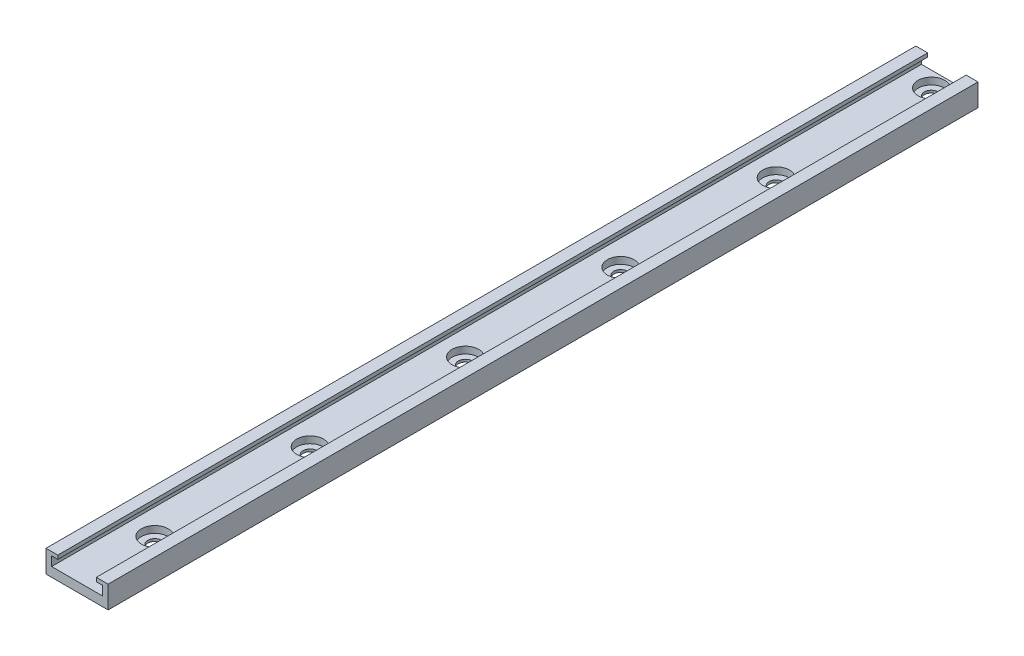
ISO-10303-21;
HEADER;
FILE_DESCRIPTION(('STEP AP214'),'2;1');
FILE_NAME('part.step','',(''),(''),'','','');
FILE_SCHEMA(('AUTOMOTIVE_DESIGN { 1 0 10303 214 1 1 1 1 }'));
ENDSEC;
DATA;
#1=APPLICATION_CONTEXT('core data for automotive mechanical design processes');
#2=APPLICATION_PROTOCOL_DEFINITION('international standard','automotive_design',2000,#1);
#3=PRODUCT_CONTEXT('',#1,'mechanical');
#4=PRODUCT('Part','Part','',(#3));
#5=PRODUCT_RELATED_PRODUCT_CATEGORY('part','',(#4));
#6=PRODUCT_DEFINITION_FORMATION('','',#4);
#7=PRODUCT_DEFINITION_CONTEXT('part definition',#1,'design');
#8=PRODUCT_DEFINITION('design','',#6,#7);
#9=PRODUCT_DEFINITION_SHAPE('','',#8);
#10=(LENGTH_UNIT() NAMED_UNIT(*) SI_UNIT(.MILLI.,.METRE.));
#11=(NAMED_UNIT(*) PLANE_ANGLE_UNIT() SI_UNIT($,.RADIAN.));
#12=(NAMED_UNIT(*) SI_UNIT($,.STERADIAN.) SOLID_ANGLE_UNIT());
#13=UNCERTAINTY_MEASURE_WITH_UNIT(LENGTH_MEASURE(1.E-05),#10,'distance_accuracy_value','');
#14=(GEOMETRIC_REPRESENTATION_CONTEXT(3) GLOBAL_UNCERTAINTY_ASSIGNED_CONTEXT((#13)) GLOBAL_UNIT_ASSIGNED_CONTEXT((#10,
#11,#12)) REPRESENTATION_CONTEXT('',''));
#15=CARTESIAN_POINT('',(0.,0.,0.));
#16=DIRECTION('',(0.,0.,1.));
#17=DIRECTION('',(1.,0.,0.));
#18=AXIS2_PLACEMENT_3D('',#15,#16,#17);
#19=CARTESIAN_POINT('',(18.2,5.9696814147909,280.));
#20=DIRECTION('',(1.,0.,0.));
#21=DIRECTION('',(0.,0.,-1.));
#22=AXIS2_PLACEMENT_3D('',#19,#20,#21);
#23=PLANE('',#22);
#24=DIRECTION('',(0.,-1.,0.));
#25=VECTOR('',#24,1.);
#26=CARTESIAN_POINT('',(18.2,5.9696814147909,0.));
#27=LINE('',#26,#25);
#28=CARTESIAN_POINT('',(18.2,5.9696814147909,0.));
#29=VERTEX_POINT('',#28);
#30=CARTESIAN_POINT('',(18.2,3.,0.));
#31=VERTEX_POINT('',#30);
#32=EDGE_CURVE('E152',#29,#31,#27,.T.);
#33=ORIENTED_EDGE('',*,*,#32,.T.);
#34=DIRECTION('',(0.,0.,-1.));
#35=VECTOR('',#34,1.);
#36=CARTESIAN_POINT('',(18.2,3.,280.));
#37=LINE('',#36,#35);
#38=CARTESIAN_POINT('',(18.2,3.,280.));
#39=VERTEX_POINT('',#38);
#40=EDGE_CURVE('E11',#39,#31,#37,.T.);
#41=ORIENTED_EDGE('',*,*,#40,.F.);
#42=DIRECTION('',(0.,-1.,0.));
#43=VECTOR('',#42,1.);
#44=CARTESIAN_POINT('',(18.2,5.9696814147909,280.));
#45=LINE('',#44,#43);
#46=CARTESIAN_POINT('',(18.2,5.9696814147909,280.));
#47=VERTEX_POINT('',#46);
#48=EDGE_CURVE('E175',#47,#39,#45,.T.);
#49=ORIENTED_EDGE('',*,*,#48,.F.);
#50=DIRECTION('',(0.,0.,-1.));
#51=VECTOR('',#50,1.);
#52=CARTESIAN_POINT('',(18.2,5.9696814147909,280.));
#53=LINE('',#52,#51);
#54=EDGE_CURVE('E148',#47,#29,#53,.T.);
#55=ORIENTED_EDGE('',*,*,#54,.T.);
#56=EDGE_LOOP('',(#33,#41,#49,#55));
#57=FACE_BOUND('',#56,.T.);
#58=ADVANCED_FACE('F32',(#57),#23,.F.);
#59=CARTESIAN_POINT('',(18.2,3.,280.));
#60=DIRECTION('',(0.,-1.,0.));
#61=DIRECTION('',(1.,0.,0.));
#62=AXIS2_PLACEMENT_3D('',#59,#60,#61);
#63=PLANE('',#62);
#64=CARTESIAN_POINT('',(10.,3.,5.));
#65=DIRECTION('',(0.,1.,0.));
#66=DIRECTION('',(0.,0.,1.));
#67=AXIS2_PLACEMENT_3D('',#64,#65,#66);
#68=CIRCLE('',#67,4.29999999999999);
#69=CARTESIAN_POINT('',(10.,3.,9.3));
#70=VERTEX_POINT('',#69);
#71=EDGE_CURVE('E511',#70,#70,#68,.T.);
#72=ORIENTED_EDGE('',*,*,#71,.F.);
#73=EDGE_LOOP('',(#72));
#74=FACE_BOUND('',#73,.T.);
#75=CARTESIAN_POINT('',(10.,3.,255.));
#76=DIRECTION('',(0.,1.,0.));
#77=DIRECTION('',(0.,0.,1.));
#78=AXIS2_PLACEMENT_3D('',#75,#76,#77);
#79=CIRCLE('',#78,4.3);
#80=CARTESIAN_POINT('',(10.,3.,259.3));
#81=VERTEX_POINT('',#80);
#82=EDGE_CURVE('E521',#81,#81,#79,.T.);
#83=ORIENTED_EDGE('',*,*,#82,.F.);
#84=EDGE_LOOP('',(#83));
#85=FACE_BOUND('',#84,.T.);
#86=CARTESIAN_POINT('',(10.,3.,205.));
#87=DIRECTION('',(0.,1.,0.));
#88=DIRECTION('',(0.,0.,1.));
#89=AXIS2_PLACEMENT_3D('',#86,#87,#88);
#90=CIRCLE('',#89,4.3);
#91=CARTESIAN_POINT('',(10.,3.,209.3));
#92=VERTEX_POINT('',#91);
#93=EDGE_CURVE('E533',#92,#92,#90,.T.);
#94=ORIENTED_EDGE('',*,*,#93,.F.);
#95=EDGE_LOOP('',(#94));
#96=FACE_BOUND('',#95,.T.);
#97=CARTESIAN_POINT('',(10.,3.,155.));
#98=DIRECTION('',(0.,1.,0.));
#99=DIRECTION('',(0.,0.,1.));
#100=AXIS2_PLACEMENT_3D('',#97,#98,#99);
#101=CIRCLE('',#100,4.3);
#102=CARTESIAN_POINT('',(10.,3.,159.3));
#103=VERTEX_POINT('',#102);
#104=EDGE_CURVE('E545',#103,#103,#101,.T.);
#105=ORIENTED_EDGE('',*,*,#104,.F.);
#106=EDGE_LOOP('',(#105));
#107=FACE_BOUND('',#106,.T.);
#108=CARTESIAN_POINT('',(10.,3.,105.));
#109=DIRECTION('',(0.,1.,0.));
#110=DIRECTION('',(0.,0.,1.));
#111=AXIS2_PLACEMENT_3D('',#108,#109,#110);
#112=CIRCLE('',#111,4.3);
#113=CARTESIAN_POINT('',(10.,3.,109.3));
#114=VERTEX_POINT('',#113);
#115=EDGE_CURVE('E557',#114,#114,#112,.T.);
#116=ORIENTED_EDGE('',*,*,#115,.F.);
#117=EDGE_LOOP('',(#116));
#118=FACE_BOUND('',#117,.T.);
#119=CARTESIAN_POINT('',(10.,3.,55.));
#120=DIRECTION('',(0.,1.,0.));
#121=DIRECTION('',(0.,0.,1.));
#122=AXIS2_PLACEMENT_3D('',#119,#120,#121);
#123=CIRCLE('',#122,4.3);
#124=CARTESIAN_POINT('',(10.,3.,59.3));
#125=VERTEX_POINT('',#124);
#126=EDGE_CURVE('E569',#125,#125,#123,.T.);
#127=ORIENTED_EDGE('',*,*,#126,.F.);
#128=EDGE_LOOP('',(#127));
#129=FACE_BOUND('',#128,.T.);
#130=DIRECTION('',(-1.,0.,0.));
#131=VECTOR('',#130,1.);
#132=CARTESIAN_POINT('',(18.2,3.,0.));
#133=LINE('',#132,#131);
#134=CARTESIAN_POINT('',(1.8,3.,0.));
#135=VERTEX_POINT('',#134);
#136=EDGE_CURVE('E155',#31,#135,#133,.T.);
#137=ORIENTED_EDGE('',*,*,#136,.T.);
#138=DIRECTION('',(0.,0.,-1.));
#139=VECTOR('',#138,1.);
#140=CARTESIAN_POINT('',(1.8,3.,280.));
#141=LINE('',#140,#139);
#142=CARTESIAN_POINT('',(1.8,3.,280.));
#143=VERTEX_POINT('',#142);
#144=EDGE_CURVE('E40',#143,#135,#141,.T.);
#145=ORIENTED_EDGE('',*,*,#144,.F.);
#146=DIRECTION('',(-1.,0.,0.));
#147=VECTOR('',#146,1.);
#148=CARTESIAN_POINT('',(18.2,3.,280.));
#149=LINE('',#148,#147);
#150=EDGE_CURVE('E103',#39,#143,#149,.T.);
#151=ORIENTED_EDGE('',*,*,#150,.F.);
#152=ORIENTED_EDGE('',*,*,#40,.T.);
#153=EDGE_LOOP('',(#137,#145,#151,#152));
#154=FACE_BOUND('',#153,.T.);
#155=ADVANCED_FACE('F253',(#74,#85,#96,#107,#118,#129,#154),#63,.F.);
#156=CARTESIAN_POINT('',(1.8,3.,280.));
#157=DIRECTION('',(-1.,0.,0.));
#158=DIRECTION('',(0.,0.,1.));
#159=AXIS2_PLACEMENT_3D('',#156,#157,#158);
#160=PLANE('',#159);
#161=DIRECTION('',(0.,1.,0.));
#162=VECTOR('',#161,1.);
#163=CARTESIAN_POINT('',(1.8,3.,0.));
#164=LINE('',#163,#162);
#165=CARTESIAN_POINT('',(1.8,6.,0.));
#166=VERTEX_POINT('',#165);
#167=EDGE_CURVE('E158',#135,#166,#164,.T.);
#168=ORIENTED_EDGE('',*,*,#167,.T.);
#169=DIRECTION('',(0.,0.,-1.));
#170=VECTOR('',#169,1.);
#171=CARTESIAN_POINT('',(1.8,6.,280.));
#172=LINE('',#171,#170);
#173=CARTESIAN_POINT('',(1.8,6.,280.));
#174=VERTEX_POINT('',#173);
#175=EDGE_CURVE('E194',#174,#166,#172,.T.);
#176=ORIENTED_EDGE('',*,*,#175,.F.);
#177=DIRECTION('',(0.,1.,0.));
#178=VECTOR('',#177,1.);
#179=CARTESIAN_POINT('',(1.8,3.,280.));
#180=LINE('',#179,#178);
#181=EDGE_CURVE('E202',#143,#174,#180,.T.);
#182=ORIENTED_EDGE('',*,*,#181,.F.);
#183=ORIENTED_EDGE('',*,*,#144,.T.);
#184=EDGE_LOOP('',(#168,#176,#182,#183));
#185=FACE_BOUND('',#184,.T.);
#186=ADVANCED_FACE('F200',(#185),#160,.F.);
#187=CARTESIAN_POINT('',(1.8,6.,280.));
#188=DIRECTION('',(0.,1.,0.));
#189=DIRECTION('',(0.,0.,1.));
#190=AXIS2_PLACEMENT_3D('',#187,#188,#189);
#191=PLANE('',#190);
#192=DIRECTION('',(1.,0.,0.));
#193=VECTOR('',#192,1.);
#194=CARTESIAN_POINT('',(1.8,6.,0.));
#195=LINE('',#194,#193);
#196=CARTESIAN_POINT('',(3.8,6.,0.));
#197=VERTEX_POINT('',#196);
#198=EDGE_CURVE('E160',#166,#197,#195,.T.);
#199=ORIENTED_EDGE('',*,*,#198,.T.);
#200=DIRECTION('',(0.,0.,-1.));
#201=VECTOR('',#200,1.);
#202=CARTESIAN_POINT('',(3.8,6.,280.));
#203=LINE('',#202,#201);
#204=CARTESIAN_POINT('',(3.8,6.,280.));
#205=VERTEX_POINT('',#204);
#206=EDGE_CURVE('E191',#205,#197,#203,.T.);
#207=ORIENTED_EDGE('',*,*,#206,.F.);
#208=DIRECTION('',(1.,0.,0.));
#209=VECTOR('',#208,1.);
#210=CARTESIAN_POINT('',(1.8,6.,280.));
#211=LINE('',#210,#209);
#212=EDGE_CURVE('E220',#174,#205,#211,.T.);
#213=ORIENTED_EDGE('',*,*,#212,.F.);
#214=ORIENTED_EDGE('',*,*,#175,.T.);
#215=EDGE_LOOP('',(#199,#207,#213,#214));
#216=FACE_BOUND('',#215,.T.);
#217=ADVANCED_FACE('F211',(#216),#191,.F.);
#218=CARTESIAN_POINT('',(3.8,6.,280.));
#219=DIRECTION('',(-1.,0.,0.));
#220=DIRECTION('',(0.,0.,1.));
#221=AXIS2_PLACEMENT_3D('',#218,#219,#220);
#222=PLANE('',#221);
#223=DIRECTION('',(0.,1.,0.));
#224=VECTOR('',#223,1.);
#225=CARTESIAN_POINT('',(3.8,6.,0.));
#226=LINE('',#225,#224);
#227=CARTESIAN_POINT('',(3.8,7.2,0.));
#228=VERTEX_POINT('',#227);
#229=EDGE_CURVE('E162',#197,#228,#226,.T.);
#230=ORIENTED_EDGE('',*,*,#229,.T.);
#231=DIRECTION('',(0.,0.,-1.));
#232=VECTOR('',#231,1.);
#233=CARTESIAN_POINT('',(3.8,7.2,280.));
#234=LINE('',#233,#232);
#235=CARTESIAN_POINT('',(3.8,7.2,280.));
#236=VERTEX_POINT('',#235);
#237=EDGE_CURVE('E188',#236,#228,#234,.T.);
#238=ORIENTED_EDGE('',*,*,#237,.F.);
#239=DIRECTION('',(0.,1.,0.));
#240=VECTOR('',#239,1.);
#241=CARTESIAN_POINT('',(3.8,6.,280.));
#242=LINE('',#241,#240);
#243=EDGE_CURVE('E217',#205,#236,#242,.T.);
#244=ORIENTED_EDGE('',*,*,#243,.F.);
#245=ORIENTED_EDGE('',*,*,#206,.T.);
#246=EDGE_LOOP('',(#230,#238,#244,#245));
#247=FACE_BOUND('',#246,.T.);
#248=ADVANCED_FACE('F215',(#247),#222,.F.);
#249=CARTESIAN_POINT('',(3.8,7.2,280.));
#250=DIRECTION('',(0.,-1.,0.));
#251=DIRECTION('',(1.,0.,0.));
#252=AXIS2_PLACEMENT_3D('',#249,#250,#251);
#253=PLANE('',#252);
#254=DIRECTION('',(-1.,0.,0.));
#255=VECTOR('',#254,1.);
#256=CARTESIAN_POINT('',(3.8,7.2,0.));
#257=LINE('',#256,#255);
#258=CARTESIAN_POINT('',(0.,7.2,0.));
#259=VERTEX_POINT('',#258);
#260=EDGE_CURVE('E164',#228,#259,#257,.T.);
#261=ORIENTED_EDGE('',*,*,#260,.T.);
#262=DIRECTION('',(0.,0.,-1.));
#263=VECTOR('',#262,1.);
#264=CARTESIAN_POINT('',(0.,7.2,280.));
#265=LINE('',#264,#263);
#266=CARTESIAN_POINT('',(0.,7.2,280.));
#267=VERTEX_POINT('',#266);
#268=EDGE_CURVE('E185',#267,#259,#265,.T.);
#269=ORIENTED_EDGE('',*,*,#268,.F.);
#270=DIRECTION('',(-1.,0.,0.));
#271=VECTOR('',#270,1.);
#272=CARTESIAN_POINT('',(3.8,7.2,280.));
#273=LINE('',#272,#271);
#274=EDGE_CURVE('E219',#236,#267,#273,.T.);
#275=ORIENTED_EDGE('',*,*,#274,.F.);
#276=ORIENTED_EDGE('',*,*,#237,.T.);
#277=EDGE_LOOP('',(#261,#269,#275,#276));
#278=FACE_BOUND('',#277,.T.);
#279=ADVANCED_FACE('F269',(#278),#253,.F.);
#280=CARTESIAN_POINT('',(0.,7.2,280.));
#281=DIRECTION('',(1.,0.,0.));
#282=DIRECTION('',(0.,1.,0.));
#283=AXIS2_PLACEMENT_3D('',#280,#281,#282);
#284=PLANE('',#283);
#285=DIRECTION('',(0.,-1.,0.));
#286=VECTOR('',#285,1.);
#287=CARTESIAN_POINT('',(0.,7.2,0.));
#288=LINE('',#287,#286);
#289=CARTESIAN_POINT('',(0.,0.,0.));
#290=VERTEX_POINT('',#289);
#291=EDGE_CURVE('E166',#259,#290,#288,.T.);
#292=ORIENTED_EDGE('',*,*,#291,.T.);
#293=DIRECTION('',(0.,0.,-1.));
#294=VECTOR('',#293,1.);
#295=CARTESIAN_POINT('',(0.,0.,280.));
#296=LINE('',#295,#294);
#297=CARTESIAN_POINT('',(0.,0.,280.));
#298=VERTEX_POINT('',#297);
#299=EDGE_CURVE('E182',#298,#290,#296,.T.);
#300=ORIENTED_EDGE('',*,*,#299,.F.);
#301=DIRECTION('',(0.,-1.,0.));
#302=VECTOR('',#301,1.);
#303=CARTESIAN_POINT('',(0.,7.2,280.));
#304=LINE('',#303,#302);
#305=EDGE_CURVE('E222',#267,#298,#304,.T.);
#306=ORIENTED_EDGE('',*,*,#305,.F.);
#307=ORIENTED_EDGE('',*,*,#268,.T.);
#308=EDGE_LOOP('',(#292,#300,#306,#307));
#309=FACE_BOUND('',#308,.T.);
#310=ADVANCED_FACE('F272',(#309),#284,.F.);
#311=CARTESIAN_POINT('',(0.,0.,280.));
#312=DIRECTION('',(0.,1.,0.));
#313=DIRECTION('',(0.,0.,1.));
#314=AXIS2_PLACEMENT_3D('',#311,#312,#313);
#315=PLANE('',#314);
#316=CARTESIAN_POINT('',(10.,0.,5.));
#317=DIRECTION('',(0.,1.,0.));
#318=DIRECTION('',(0.,0.,1.));
#319=AXIS2_PLACEMENT_3D('',#316,#317,#318);
#320=CIRCLE('',#319,2.25);
#321=CARTESIAN_POINT('',(10.,0.,7.25));
#322=VERTEX_POINT('',#321);
#323=EDGE_CURVE('E518',#322,#322,#320,.T.);
#324=ORIENTED_EDGE('',*,*,#323,.T.);
#325=EDGE_LOOP('',(#324));
#326=FACE_BOUND('',#325,.T.);
#327=CARTESIAN_POINT('',(10.,0.,255.));
#328=DIRECTION('',(0.,1.,0.));
#329=DIRECTION('',(0.,0.,1.));
#330=AXIS2_PLACEMENT_3D('',#327,#328,#329);
#331=CIRCLE('',#330,2.25);
#332=CARTESIAN_POINT('',(10.,0.,257.25));
#333=VERTEX_POINT('',#332);
#334=EDGE_CURVE('E530',#333,#333,#331,.T.);
#335=ORIENTED_EDGE('',*,*,#334,.T.);
#336=EDGE_LOOP('',(#335));
#337=FACE_BOUND('',#336,.T.);
#338=CARTESIAN_POINT('',(10.,0.,205.));
#339=DIRECTION('',(0.,1.,0.));
#340=DIRECTION('',(0.,0.,1.));
#341=AXIS2_PLACEMENT_3D('',#338,#339,#340);
#342=CIRCLE('',#341,2.25);
#343=CARTESIAN_POINT('',(10.,0.,207.25));
#344=VERTEX_POINT('',#343);
#345=EDGE_CURVE('E542',#344,#344,#342,.T.);
#346=ORIENTED_EDGE('',*,*,#345,.T.);
#347=EDGE_LOOP('',(#346));
#348=FACE_BOUND('',#347,.T.);
#349=CARTESIAN_POINT('',(10.,0.,155.));
#350=DIRECTION('',(0.,1.,0.));
#351=DIRECTION('',(0.,0.,1.));
#352=AXIS2_PLACEMENT_3D('',#349,#350,#351);
#353=CIRCLE('',#352,2.25);
#354=CARTESIAN_POINT('',(10.,0.,157.25));
#355=VERTEX_POINT('',#354);
#356=EDGE_CURVE('E554',#355,#355,#353,.T.);
#357=ORIENTED_EDGE('',*,*,#356,.T.);
#358=EDGE_LOOP('',(#357));
#359=FACE_BOUND('',#358,.T.);
#360=CARTESIAN_POINT('',(10.,0.,105.));
#361=DIRECTION('',(0.,1.,0.));
#362=DIRECTION('',(0.,0.,1.));
#363=AXIS2_PLACEMENT_3D('',#360,#361,#362);
#364=CIRCLE('',#363,2.25);
#365=CARTESIAN_POINT('',(10.,0.,107.25));
#366=VERTEX_POINT('',#365);
#367=EDGE_CURVE('E566',#366,#366,#364,.T.);
#368=ORIENTED_EDGE('',*,*,#367,.T.);
#369=EDGE_LOOP('',(#368));
#370=FACE_BOUND('',#369,.T.);
#371=CARTESIAN_POINT('',(10.,0.,55.));
#372=DIRECTION('',(0.,1.,0.));
#373=DIRECTION('',(0.,0.,1.));
#374=AXIS2_PLACEMENT_3D('',#371,#372,#373);
#375=CIRCLE('',#374,2.25);
#376=CARTESIAN_POINT('',(10.,0.,57.25));
#377=VERTEX_POINT('',#376);
#378=EDGE_CURVE('E156',#377,#377,#375,.T.);
#379=ORIENTED_EDGE('',*,*,#378,.T.);
#380=EDGE_LOOP('',(#379));
#381=FACE_BOUND('',#380,.T.);
#382=DIRECTION('',(1.,0.,0.));
#383=VECTOR('',#382,1.);
#384=CARTESIAN_POINT('',(0.,0.,0.));
#385=LINE('',#384,#383);
#386=CARTESIAN_POINT('',(20.,0.,0.));
#387=VERTEX_POINT('',#386);
#388=EDGE_CURVE('E168',#290,#387,#385,.T.);
#389=ORIENTED_EDGE('',*,*,#388,.T.);
#390=DIRECTION('',(0.,0.,-1.));
#391=VECTOR('',#390,1.);
#392=CARTESIAN_POINT('',(20.,0.,280.));
#393=LINE('',#392,#391);
#394=CARTESIAN_POINT('',(20.,0.,280.));
#395=VERTEX_POINT('',#394);
#396=EDGE_CURVE('E179',#395,#387,#393,.T.);
#397=ORIENTED_EDGE('',*,*,#396,.F.);
#398=DIRECTION('',(1.,0.,0.));
#399=VECTOR('',#398,1.);
#400=CARTESIAN_POINT('',(0.,0.,280.));
#401=LINE('',#400,#399);
#402=EDGE_CURVE('E228',#298,#395,#401,.T.);
#403=ORIENTED_EDGE('',*,*,#402,.F.);
#404=ORIENTED_EDGE('',*,*,#299,.T.);
#405=EDGE_LOOP('',(#389,#397,#403,#404));
#406=FACE_BOUND('',#405,.T.);
#407=ADVANCED_FACE('F234',(#326,#337,#348,#359,#370,#381,#406),#315,.F.);
#408=CARTESIAN_POINT('',(20.,0.,280.));
#409=DIRECTION('',(-1.,0.,0.));
#410=DIRECTION('',(0.,0.,1.));
#411=AXIS2_PLACEMENT_3D('',#408,#409,#410);
#412=PLANE('',#411);
#413=DIRECTION('',(0.,1.,0.));
#414=VECTOR('',#413,1.);
#415=CARTESIAN_POINT('',(20.,0.,0.));
#416=LINE('',#415,#414);
#417=CARTESIAN_POINT('',(20.,7.2,0.));
#418=VERTEX_POINT('',#417);
#419=EDGE_CURVE('E170',#387,#418,#416,.T.);
#420=ORIENTED_EDGE('',*,*,#419,.T.);
#421=DIRECTION('',(0.,0.,-1.));
#422=VECTOR('',#421,1.);
#423=CARTESIAN_POINT('',(20.,7.2,280.));
#424=LINE('',#423,#422);
#425=CARTESIAN_POINT('',(20.,7.2,280.));
#426=VERTEX_POINT('',#425);
#427=EDGE_CURVE('E143',#426,#418,#424,.T.);
#428=ORIENTED_EDGE('',*,*,#427,.F.);
#429=DIRECTION('',(0.,1.,0.));
#430=VECTOR('',#429,1.);
#431=CARTESIAN_POINT('',(20.,0.,280.));
#432=LINE('',#431,#430);
#433=EDGE_CURVE('E134',#395,#426,#432,.T.);
#434=ORIENTED_EDGE('',*,*,#433,.F.);
#435=ORIENTED_EDGE('',*,*,#396,.T.);
#436=EDGE_LOOP('',(#420,#428,#434,#435));
#437=FACE_BOUND('',#436,.T.);
#438=ADVANCED_FACE('F238',(#437),#412,.F.);
#439=CARTESIAN_POINT('',(20.,7.2,280.));
#440=DIRECTION('',(0.,-1.,0.));
#441=DIRECTION('',(1.,0.,0.));
#442=AXIS2_PLACEMENT_3D('',#439,#440,#441);
#443=PLANE('',#442);
#444=DIRECTION('',(-1.,0.,0.));
#445=VECTOR('',#444,1.);
#446=CARTESIAN_POINT('',(20.,7.2,0.));
#447=LINE('',#446,#445);
#448=CARTESIAN_POINT('',(16.2,7.2,0.));
#449=VERTEX_POINT('',#448);
#450=EDGE_CURVE('E142',#418,#449,#447,.T.);
#451=ORIENTED_EDGE('',*,*,#450,.T.);
#452=DIRECTION('',(0.,0.,-1.));
#453=VECTOR('',#452,1.);
#454=CARTESIAN_POINT('',(16.2,7.2,280.));
#455=LINE('',#454,#453);
#456=CARTESIAN_POINT('',(16.2,7.2,280.));
#457=VERTEX_POINT('',#456);
#458=EDGE_CURVE('E139',#457,#449,#455,.T.);
#459=ORIENTED_EDGE('',*,*,#458,.F.);
#460=DIRECTION('',(-1.,0.,0.));
#461=VECTOR('',#460,1.);
#462=CARTESIAN_POINT('',(20.,7.2,280.));
#463=LINE('',#462,#461);
#464=EDGE_CURVE('E128',#426,#457,#463,.T.);
#465=ORIENTED_EDGE('',*,*,#464,.F.);
#466=ORIENTED_EDGE('',*,*,#427,.T.);
#467=EDGE_LOOP('',(#451,#459,#465,#466));
#468=FACE_BOUND('',#467,.T.);
#469=ADVANCED_FACE('F140',(#468),#443,.F.);
#470=CARTESIAN_POINT('',(16.2,7.2,280.));
#471=DIRECTION('',(1.,0.,0.));
#472=DIRECTION('',(0.,0.,-1.));
#473=AXIS2_PLACEMENT_3D('',#470,#471,#472);
#474=PLANE('',#473);
#475=DIRECTION('',(0.,-1.,0.));
#476=VECTOR('',#475,1.);
#477=CARTESIAN_POINT('',(16.2,7.2,0.));
#478=LINE('',#477,#476);
#479=CARTESIAN_POINT('',(16.2,5.9696814147909,0.));
#480=VERTEX_POINT('',#479);
#481=EDGE_CURVE('E89',#449,#480,#478,.T.);
#482=ORIENTED_EDGE('',*,*,#481,.T.);
#483=DIRECTION('',(0.,0.,-1.));
#484=VECTOR('',#483,1.);
#485=CARTESIAN_POINT('',(16.2,5.9696814147909,280.));
#486=LINE('',#485,#484);
#487=CARTESIAN_POINT('',(16.2,5.9696814147909,280.));
#488=VERTEX_POINT('',#487);
#489=EDGE_CURVE('E144',#488,#480,#486,.T.);
#490=ORIENTED_EDGE('',*,*,#489,.F.);
#491=DIRECTION('',(0.,-1.,0.));
#492=VECTOR('',#491,1.);
#493=CARTESIAN_POINT('',(16.2,7.2,280.));
#494=LINE('',#493,#492);
#495=EDGE_CURVE('E132',#457,#488,#494,.T.);
#496=ORIENTED_EDGE('',*,*,#495,.F.);
#497=ORIENTED_EDGE('',*,*,#458,.T.);
#498=EDGE_LOOP('',(#482,#490,#496,#497));
#499=FACE_BOUND('',#498,.T.);
#500=ADVANCED_FACE('F146',(#499),#474,.F.);
#501=CARTESIAN_POINT('',(16.2,5.9696814147909,280.));
#502=DIRECTION('',(0.,1.,0.));
#503=DIRECTION('',(0.,0.,1.));
#504=AXIS2_PLACEMENT_3D('',#501,#502,#503);
#505=PLANE('',#504);
#506=DIRECTION('',(1.,0.,0.));
#507=VECTOR('',#506,1.);
#508=CARTESIAN_POINT('',(16.2,5.9696814147909,0.));
#509=LINE('',#508,#507);
#510=EDGE_CURVE('E95',#480,#29,#509,.T.);
#511=ORIENTED_EDGE('',*,*,#510,.T.);
#512=ORIENTED_EDGE('',*,*,#54,.F.);
#513=DIRECTION('',(1.,0.,0.));
#514=VECTOR('',#513,1.);
#515=CARTESIAN_POINT('',(16.2,5.9696814147909,280.));
#516=LINE('',#515,#514);
#517=EDGE_CURVE('E48',#488,#47,#516,.T.);
#518=ORIENTED_EDGE('',*,*,#517,.F.);
#519=ORIENTED_EDGE('',*,*,#489,.T.);
#520=EDGE_LOOP('',(#511,#512,#518,#519));
#521=FACE_BOUND('',#520,.T.);
#522=ADVANCED_FACE('F242',(#521),#505,.F.);
#523=CARTESIAN_POINT('',(0.,0.,280.));
#524=DIRECTION('',(0.,0.,-1.));
#525=DIRECTION('',(-1.,0.,0.));
#526=AXIS2_PLACEMENT_3D('',#523,#524,#525);
#527=PLANE('',#526);
#528=ORIENTED_EDGE('',*,*,#48,.T.);
#529=ORIENTED_EDGE('',*,*,#150,.T.);
#530=ORIENTED_EDGE('',*,*,#181,.T.);
#531=ORIENTED_EDGE('',*,*,#212,.T.);
#532=ORIENTED_EDGE('',*,*,#243,.T.);
#533=ORIENTED_EDGE('',*,*,#274,.T.);
#534=ORIENTED_EDGE('',*,*,#305,.T.);
#535=ORIENTED_EDGE('',*,*,#402,.T.);
#536=ORIENTED_EDGE('',*,*,#433,.T.);
#537=ORIENTED_EDGE('',*,*,#464,.T.);
#538=ORIENTED_EDGE('',*,*,#495,.T.);
#539=ORIENTED_EDGE('',*,*,#517,.T.);
#540=EDGE_LOOP('',(#528,#529,#530,#531,#532,#533,#534,#535,#536,#537,#538,#539));
#541=FACE_BOUND('',#540,.T.);
#542=ADVANCED_FACE('F130',(#541),#527,.F.);
#543=CARTESIAN_POINT('',(0.,0.,0.));
#544=DIRECTION('',(0.,0.,-1.));
#545=DIRECTION('',(-1.,0.,0.));
#546=AXIS2_PLACEMENT_3D('',#543,#544,#545);
#547=PLANE('',#546);
#548=ORIENTED_EDGE('',*,*,#32,.F.);
#549=ORIENTED_EDGE('',*,*,#510,.F.);
#550=ORIENTED_EDGE('',*,*,#481,.F.);
#551=ORIENTED_EDGE('',*,*,#450,.F.);
#552=ORIENTED_EDGE('',*,*,#419,.F.);
#553=ORIENTED_EDGE('',*,*,#388,.F.);
#554=ORIENTED_EDGE('',*,*,#291,.F.);
#555=ORIENTED_EDGE('',*,*,#260,.F.);
#556=ORIENTED_EDGE('',*,*,#229,.F.);
#557=ORIENTED_EDGE('',*,*,#198,.F.);
#558=ORIENTED_EDGE('',*,*,#167,.F.);
#559=ORIENTED_EDGE('',*,*,#136,.F.);
#560=EDGE_LOOP('',(#548,#549,#550,#551,#552,#553,#554,#555,#556,#557,#558,#559));
#561=FACE_BOUND('',#560,.T.);
#562=ADVANCED_FACE('F206',(#561),#547,.T.);
#563=CARTESIAN_POINT('',(10.,3.,55.));
#564=DIRECTION('',(0.,1.,0.));
#565=DIRECTION('',(0.,0.,1.));
#566=AXIS2_PLACEMENT_3D('',#563,#564,#565);
#567=CYLINDRICAL_SURFACE('',#566,2.25);
#568=ORIENTED_EDGE('',*,*,#378,.F.);
#569=EDGE_LOOP('',(#568));
#570=FACE_BOUND('',#569,.T.);
#571=CARTESIAN_POINT('',(10.,0.799999999999999,55.));
#572=DIRECTION('',(0.,1.,0.));
#573=DIRECTION('',(0.,0.,1.));
#574=AXIS2_PLACEMENT_3D('',#571,#572,#573);
#575=CIRCLE('',#574,2.25);
#576=CARTESIAN_POINT('',(10.,0.799999999999999,57.25));
#577=VERTEX_POINT('',#576);
#578=EDGE_CURVE('E575',#577,#577,#575,.T.);
#579=ORIENTED_EDGE('',*,*,#578,.T.);
#580=EDGE_LOOP('',(#579));
#581=FACE_BOUND('',#580,.T.);
#582=ADVANCED_FACE('F310',(#570,#581),#567,.F.);
#583=CARTESIAN_POINT('',(12.25,0.799999999999999,55.));
#584=DIRECTION('',(0.,-1.,0.));
#585=DIRECTION('',(0.,0.,-1.));
#586=AXIS2_PLACEMENT_3D('',#583,#584,#585);
#587=PLANE('',#586);
#588=ORIENTED_EDGE('',*,*,#578,.F.);
#589=EDGE_LOOP('',(#588));
#590=FACE_BOUND('',#589,.T.);
#591=CARTESIAN_POINT('',(10.,0.799999999999999,55.));
#592=DIRECTION('',(0.,1.,0.));
#593=DIRECTION('',(0.,0.,1.));
#594=AXIS2_PLACEMENT_3D('',#591,#592,#593);
#595=CIRCLE('',#594,4.3);
#596=CARTESIAN_POINT('',(10.,0.799999999999999,59.3));
#597=VERTEX_POINT('',#596);
#598=EDGE_CURVE('E572',#597,#597,#595,.T.);
#599=ORIENTED_EDGE('',*,*,#598,.T.);
#600=EDGE_LOOP('',(#599));
#601=FACE_BOUND('',#600,.T.);
#602=ADVANCED_FACE('F318',(#590,#601),#587,.F.);
#603=CARTESIAN_POINT('',(10.,3.,55.));
#604=DIRECTION('',(0.,1.,0.));
#605=DIRECTION('',(0.,0.,1.));
#606=AXIS2_PLACEMENT_3D('',#603,#604,#605);
#607=CYLINDRICAL_SURFACE('',#606,4.3);
#608=ORIENTED_EDGE('',*,*,#598,.F.);
#609=EDGE_LOOP('',(#608));
#610=FACE_BOUND('',#609,.T.);
#611=ORIENTED_EDGE('',*,*,#126,.T.);
#612=EDGE_LOOP('',(#611));
#613=FACE_BOUND('',#612,.T.);
#614=ADVANCED_FACE('F328',(#610,#613),#607,.F.);
#615=CARTESIAN_POINT('',(10.,3.,105.));
#616=DIRECTION('',(0.,1.,0.));
#617=DIRECTION('',(0.,0.,1.));
#618=AXIS2_PLACEMENT_3D('',#615,#616,#617);
#619=CYLINDRICAL_SURFACE('',#618,2.25);
#620=ORIENTED_EDGE('',*,*,#367,.F.);
#621=EDGE_LOOP('',(#620));
#622=FACE_BOUND('',#621,.T.);
#623=CARTESIAN_POINT('',(10.,0.799999999999999,105.));
#624=DIRECTION('',(0.,1.,0.));
#625=DIRECTION('',(0.,0.,1.));
#626=AXIS2_PLACEMENT_3D('',#623,#624,#625);
#627=CIRCLE('',#626,2.25);
#628=CARTESIAN_POINT('',(10.,0.799999999999999,107.25));
#629=VERTEX_POINT('',#628);
#630=EDGE_CURVE('E563',#629,#629,#627,.T.);
#631=ORIENTED_EDGE('',*,*,#630,.T.);
#632=EDGE_LOOP('',(#631));
#633=FACE_BOUND('',#632,.T.);
#634=ADVANCED_FACE('F338',(#622,#633),#619,.F.);
#635=CARTESIAN_POINT('',(12.25,0.799999999999999,105.));
#636=DIRECTION('',(0.,-1.,0.));
#637=DIRECTION('',(0.,0.,-1.));
#638=AXIS2_PLACEMENT_3D('',#635,#636,#637);
#639=PLANE('',#638);
#640=ORIENTED_EDGE('',*,*,#630,.F.);
#641=EDGE_LOOP('',(#640));
#642=FACE_BOUND('',#641,.T.);
#643=CARTESIAN_POINT('',(10.,0.799999999999999,105.));
#644=DIRECTION('',(0.,1.,0.));
#645=DIRECTION('',(0.,0.,1.));
#646=AXIS2_PLACEMENT_3D('',#643,#644,#645);
#647=CIRCLE('',#646,4.3);
#648=CARTESIAN_POINT('',(10.,0.799999999999999,109.3));
#649=VERTEX_POINT('',#648);
#650=EDGE_CURVE('E560',#649,#649,#647,.T.);
#651=ORIENTED_EDGE('',*,*,#650,.T.);
#652=EDGE_LOOP('',(#651));
#653=FACE_BOUND('',#652,.T.);
#654=ADVANCED_FACE('F348',(#642,#653),#639,.F.);
#655=CARTESIAN_POINT('',(10.,3.,105.));
#656=DIRECTION('',(0.,1.,0.));
#657=DIRECTION('',(0.,0.,1.));
#658=AXIS2_PLACEMENT_3D('',#655,#656,#657);
#659=CYLINDRICAL_SURFACE('',#658,4.3);
#660=ORIENTED_EDGE('',*,*,#650,.F.);
#661=EDGE_LOOP('',(#660));
#662=FACE_BOUND('',#661,.T.);
#663=ORIENTED_EDGE('',*,*,#115,.T.);
#664=EDGE_LOOP('',(#663));
#665=FACE_BOUND('',#664,.T.);
#666=ADVANCED_FACE('F358',(#662,#665),#659,.F.);
#667=CARTESIAN_POINT('',(10.,3.,155.));
#668=DIRECTION('',(0.,1.,0.));
#669=DIRECTION('',(0.,0.,1.));
#670=AXIS2_PLACEMENT_3D('',#667,#668,#669);
#671=CYLINDRICAL_SURFACE('',#670,2.25);
#672=ORIENTED_EDGE('',*,*,#356,.F.);
#673=EDGE_LOOP('',(#672));
#674=FACE_BOUND('',#673,.T.);
#675=CARTESIAN_POINT('',(10.,0.799999999999999,155.));
#676=DIRECTION('',(0.,1.,0.));
#677=DIRECTION('',(0.,0.,1.));
#678=AXIS2_PLACEMENT_3D('',#675,#676,#677);
#679=CIRCLE('',#678,2.25);
#680=CARTESIAN_POINT('',(10.,0.799999999999999,157.25));
#681=VERTEX_POINT('',#680);
#682=EDGE_CURVE('E551',#681,#681,#679,.T.);
#683=ORIENTED_EDGE('',*,*,#682,.T.);
#684=EDGE_LOOP('',(#683));
#685=FACE_BOUND('',#684,.T.);
#686=ADVANCED_FACE('F368',(#674,#685),#671,.F.);
#687=CARTESIAN_POINT('',(12.25,0.799999999999999,155.));
#688=DIRECTION('',(0.,-1.,0.));
#689=DIRECTION('',(0.,0.,-1.));
#690=AXIS2_PLACEMENT_3D('',#687,#688,#689);
#691=PLANE('',#690);
#692=ORIENTED_EDGE('',*,*,#682,.F.);
#693=EDGE_LOOP('',(#692));
#694=FACE_BOUND('',#693,.T.);
#695=CARTESIAN_POINT('',(10.,0.799999999999999,155.));
#696=DIRECTION('',(0.,1.,0.));
#697=DIRECTION('',(0.,0.,1.));
#698=AXIS2_PLACEMENT_3D('',#695,#696,#697);
#699=CIRCLE('',#698,4.3);
#700=CARTESIAN_POINT('',(10.,0.799999999999999,159.3));
#701=VERTEX_POINT('',#700);
#702=EDGE_CURVE('E548',#701,#701,#699,.T.);
#703=ORIENTED_EDGE('',*,*,#702,.T.);
#704=EDGE_LOOP('',(#703));
#705=FACE_BOUND('',#704,.T.);
#706=ADVANCED_FACE('F378',(#694,#705),#691,.F.);
#707=CARTESIAN_POINT('',(10.,3.,155.));
#708=DIRECTION('',(0.,1.,0.));
#709=DIRECTION('',(0.,0.,1.));
#710=AXIS2_PLACEMENT_3D('',#707,#708,#709);
#711=CYLINDRICAL_SURFACE('',#710,4.3);
#712=ORIENTED_EDGE('',*,*,#702,.F.);
#713=EDGE_LOOP('',(#712));
#714=FACE_BOUND('',#713,.T.);
#715=ORIENTED_EDGE('',*,*,#104,.T.);
#716=EDGE_LOOP('',(#715));
#717=FACE_BOUND('',#716,.T.);
#718=ADVANCED_FACE('F388',(#714,#717),#711,.F.);
#719=CARTESIAN_POINT('',(10.,3.,205.));
#720=DIRECTION('',(0.,1.,0.));
#721=DIRECTION('',(0.,0.,1.));
#722=AXIS2_PLACEMENT_3D('',#719,#720,#721);
#723=CYLINDRICAL_SURFACE('',#722,2.25);
#724=ORIENTED_EDGE('',*,*,#345,.F.);
#725=EDGE_LOOP('',(#724));
#726=FACE_BOUND('',#725,.T.);
#727=CARTESIAN_POINT('',(10.,0.799999999999999,205.));
#728=DIRECTION('',(0.,1.,0.));
#729=DIRECTION('',(0.,0.,1.));
#730=AXIS2_PLACEMENT_3D('',#727,#728,#729);
#731=CIRCLE('',#730,2.25);
#732=CARTESIAN_POINT('',(10.,0.799999999999999,207.25));
#733=VERTEX_POINT('',#732);
#734=EDGE_CURVE('E539',#733,#733,#731,.T.);
#735=ORIENTED_EDGE('',*,*,#734,.T.);
#736=EDGE_LOOP('',(#735));
#737=FACE_BOUND('',#736,.T.);
#738=ADVANCED_FACE('F398',(#726,#737),#723,.F.);
#739=CARTESIAN_POINT('',(12.25,0.799999999999999,205.));
#740=DIRECTION('',(0.,-1.,0.));
#741=DIRECTION('',(0.,0.,-1.));
#742=AXIS2_PLACEMENT_3D('',#739,#740,#741);
#743=PLANE('',#742);
#744=ORIENTED_EDGE('',*,*,#734,.F.);
#745=EDGE_LOOP('',(#744));
#746=FACE_BOUND('',#745,.T.);
#747=CARTESIAN_POINT('',(10.,0.799999999999999,205.));
#748=DIRECTION('',(0.,1.,0.));
#749=DIRECTION('',(0.,0.,1.));
#750=AXIS2_PLACEMENT_3D('',#747,#748,#749);
#751=CIRCLE('',#750,4.3);
#752=CARTESIAN_POINT('',(10.,0.799999999999999,209.3));
#753=VERTEX_POINT('',#752);
#754=EDGE_CURVE('E536',#753,#753,#751,.T.);
#755=ORIENTED_EDGE('',*,*,#754,.T.);
#756=EDGE_LOOP('',(#755));
#757=FACE_BOUND('',#756,.T.);
#758=ADVANCED_FACE('F408',(#746,#757),#743,.F.);
#759=CARTESIAN_POINT('',(10.,3.,205.));
#760=DIRECTION('',(0.,1.,0.));
#761=DIRECTION('',(0.,0.,1.));
#762=AXIS2_PLACEMENT_3D('',#759,#760,#761);
#763=CYLINDRICAL_SURFACE('',#762,4.3);
#764=ORIENTED_EDGE('',*,*,#754,.F.);
#765=EDGE_LOOP('',(#764));
#766=FACE_BOUND('',#765,.T.);
#767=ORIENTED_EDGE('',*,*,#93,.T.);
#768=EDGE_LOOP('',(#767));
#769=FACE_BOUND('',#768,.T.);
#770=ADVANCED_FACE('F418',(#766,#769),#763,.F.);
#771=CARTESIAN_POINT('',(10.,3.,255.));
#772=DIRECTION('',(0.,1.,0.));
#773=DIRECTION('',(0.,0.,1.));
#774=AXIS2_PLACEMENT_3D('',#771,#772,#773);
#775=CYLINDRICAL_SURFACE('',#774,2.25);
#776=ORIENTED_EDGE('',*,*,#334,.F.);
#777=EDGE_LOOP('',(#776));
#778=FACE_BOUND('',#777,.T.);
#779=CARTESIAN_POINT('',(10.,0.799999999999999,255.));
#780=DIRECTION('',(0.,1.,0.));
#781=DIRECTION('',(0.,0.,1.));
#782=AXIS2_PLACEMENT_3D('',#779,#780,#781);
#783=CIRCLE('',#782,2.25);
#784=CARTESIAN_POINT('',(10.,0.799999999999999,257.25));
#785=VERTEX_POINT('',#784);
#786=EDGE_CURVE('E527',#785,#785,#783,.T.);
#787=ORIENTED_EDGE('',*,*,#786,.T.);
#788=EDGE_LOOP('',(#787));
#789=FACE_BOUND('',#788,.T.);
#790=ADVANCED_FACE('F428',(#778,#789),#775,.F.);
#791=CARTESIAN_POINT('',(12.25,0.799999999999999,255.));
#792=DIRECTION('',(0.,-1.,0.));
#793=DIRECTION('',(0.,0.,-1.));
#794=AXIS2_PLACEMENT_3D('',#791,#792,#793);
#795=PLANE('',#794);
#796=ORIENTED_EDGE('',*,*,#786,.F.);
#797=EDGE_LOOP('',(#796));
#798=FACE_BOUND('',#797,.T.);
#799=CARTESIAN_POINT('',(10.,0.799999999999999,255.));
#800=DIRECTION('',(0.,1.,0.));
#801=DIRECTION('',(0.,0.,1.));
#802=AXIS2_PLACEMENT_3D('',#799,#800,#801);
#803=CIRCLE('',#802,4.3);
#804=CARTESIAN_POINT('',(10.,0.799999999999999,259.3));
#805=VERTEX_POINT('',#804);
#806=EDGE_CURVE('E524',#805,#805,#803,.T.);
#807=ORIENTED_EDGE('',*,*,#806,.T.);
#808=EDGE_LOOP('',(#807));
#809=FACE_BOUND('',#808,.T.);
#810=ADVANCED_FACE('F438',(#798,#809),#795,.F.);
#811=CARTESIAN_POINT('',(10.,3.,255.));
#812=DIRECTION('',(0.,1.,0.));
#813=DIRECTION('',(0.,0.,1.));
#814=AXIS2_PLACEMENT_3D('',#811,#812,#813);
#815=CYLINDRICAL_SURFACE('',#814,4.3);
#816=ORIENTED_EDGE('',*,*,#806,.F.);
#817=EDGE_LOOP('',(#816));
#818=FACE_BOUND('',#817,.T.);
#819=ORIENTED_EDGE('',*,*,#82,.T.);
#820=EDGE_LOOP('',(#819));
#821=FACE_BOUND('',#820,.T.);
#822=ADVANCED_FACE('F448',(#818,#821),#815,.F.);
#823=CARTESIAN_POINT('',(10.,3.,5.));
#824=DIRECTION('',(0.,1.,0.));
#825=DIRECTION('',(0.,0.,1.));
#826=AXIS2_PLACEMENT_3D('',#823,#824,#825);
#827=CYLINDRICAL_SURFACE('',#826,2.25000000000001);
#828=ORIENTED_EDGE('',*,*,#323,.F.);
#829=EDGE_LOOP('',(#828));
#830=FACE_BOUND('',#829,.T.);
#831=CARTESIAN_POINT('',(10.,0.799999999999998,5.));
#832=DIRECTION('',(0.,1.,0.));
#833=DIRECTION('',(0.,0.,1.));
#834=AXIS2_PLACEMENT_3D('',#831,#832,#833);
#835=CIRCLE('',#834,2.25000000000001);
#836=CARTESIAN_POINT('',(10.,0.799999999999998,7.25000000000001));
#837=VERTEX_POINT('',#836);
#838=EDGE_CURVE('E513',#837,#837,#835,.T.);
#839=ORIENTED_EDGE('',*,*,#838,.T.);
#840=EDGE_LOOP('',(#839));
#841=FACE_BOUND('',#840,.T.);
#842=ADVANCED_FACE('F457',(#830,#841),#827,.F.);
#843=CARTESIAN_POINT('',(12.25,0.799999999999998,5.));
#844=DIRECTION('',(0.,-1.,0.));
#845=DIRECTION('',(0.,0.,-1.));
#846=AXIS2_PLACEMENT_3D('',#843,#844,#845);
#847=PLANE('',#846);
#848=ORIENTED_EDGE('',*,*,#838,.F.);
#849=EDGE_LOOP('',(#848));
#850=FACE_BOUND('',#849,.T.);
#851=CARTESIAN_POINT('',(10.,0.799999999999998,5.));
#852=DIRECTION('',(0.,1.,0.));
#853=DIRECTION('',(0.,0.,1.));
#854=AXIS2_PLACEMENT_3D('',#851,#852,#853);
#855=CIRCLE('',#854,4.29999999999999);
#856=CARTESIAN_POINT('',(10.,0.799999999999998,9.3));
#857=VERTEX_POINT('',#856);
#858=EDGE_CURVE('E509',#857,#857,#855,.T.);
#859=ORIENTED_EDGE('',*,*,#858,.T.);
#860=EDGE_LOOP('',(#859));
#861=FACE_BOUND('',#860,.T.);
#862=ADVANCED_FACE('F482',(#850,#861),#847,.F.);
#863=CARTESIAN_POINT('',(10.,3.,5.));
#864=DIRECTION('',(0.,1.,0.));
#865=DIRECTION('',(0.,0.,1.));
#866=AXIS2_PLACEMENT_3D('',#863,#864,#865);
#867=CYLINDRICAL_SURFACE('',#866,4.29999999999999);
#868=ORIENTED_EDGE('',*,*,#858,.F.);
#869=EDGE_LOOP('',(#868));
#870=FACE_BOUND('',#869,.T.);
#871=ORIENTED_EDGE('',*,*,#71,.T.);
#872=EDGE_LOOP('',(#871));
#873=FACE_BOUND('',#872,.T.);
#874=ADVANCED_FACE('F492',(#870,#873),#867,.F.);
#875=CLOSED_SHELL('',(#58,#155,#186,#217,#248,#279,#310,#407,#438,#469,#500,#522,#542,#562,#582,
#602,#614,#634,#654,#666,#686,#706,#718,#738,#758,#770,#790,#810,#822,#842,#862,#874));
#876=MANIFOLD_SOLID_BREP('B2',#875);
#877=ADVANCED_BREP_SHAPE_REPRESENTATION('',(#18,#876),#14);
#878=SHAPE_DEFINITION_REPRESENTATION(#9,#877);
ENDSEC;
END-ISO-10303-21;
